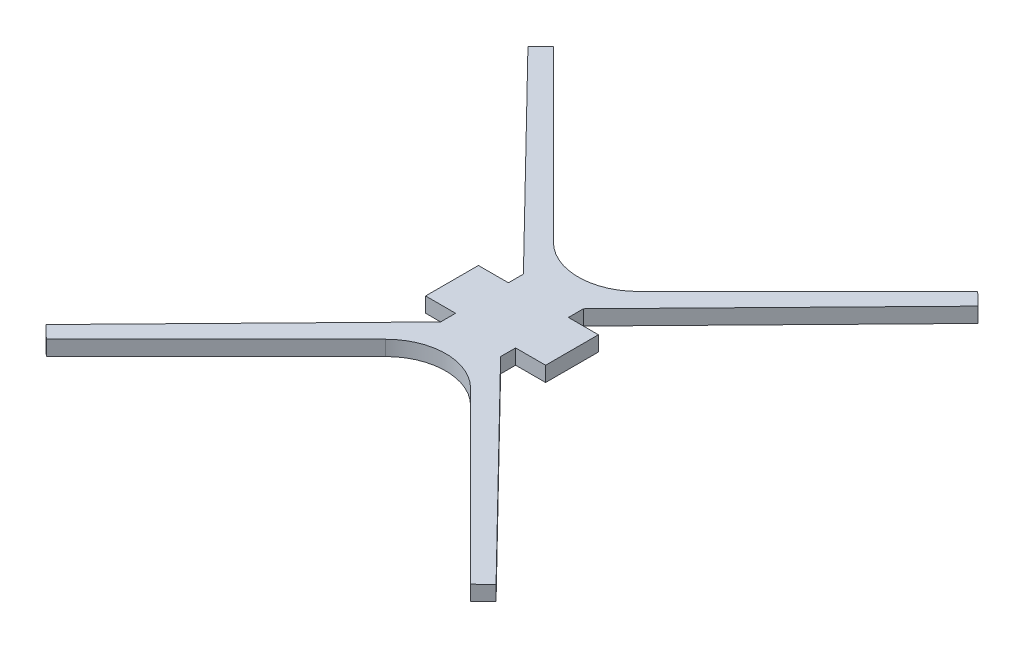
ISO-10303-21;
HEADER;
FILE_DESCRIPTION(('STEP AP214'),'2;1');
FILE_NAME('part.step','',(''),(''),'','','');
FILE_SCHEMA(('AUTOMOTIVE_DESIGN { 1 0 10303 214 1 1 1 1 }'));
ENDSEC;
DATA;
#1=APPLICATION_CONTEXT('core data for automotive mechanical design processes');
#2=APPLICATION_PROTOCOL_DEFINITION('international standard','automotive_design',2000,#1);
#3=PRODUCT_CONTEXT('',#1,'mechanical');
#4=PRODUCT('Part','Part','',(#3));
#5=PRODUCT_RELATED_PRODUCT_CATEGORY('part','',(#4));
#6=PRODUCT_DEFINITION_FORMATION('','',#4);
#7=PRODUCT_DEFINITION_CONTEXT('part definition',#1,'design');
#8=PRODUCT_DEFINITION('design','',#6,#7);
#9=PRODUCT_DEFINITION_SHAPE('','',#8);
#10=(LENGTH_UNIT() NAMED_UNIT(*) SI_UNIT(.MILLI.,.METRE.));
#11=(NAMED_UNIT(*) PLANE_ANGLE_UNIT() SI_UNIT($,.RADIAN.));
#12=(NAMED_UNIT(*) SI_UNIT($,.STERADIAN.) SOLID_ANGLE_UNIT());
#13=UNCERTAINTY_MEASURE_WITH_UNIT(LENGTH_MEASURE(1.E-05),#10,'distance_accuracy_value','');
#14=(GEOMETRIC_REPRESENTATION_CONTEXT(3) GLOBAL_UNCERTAINTY_ASSIGNED_CONTEXT((#13)) GLOBAL_UNIT_ASSIGNED_CONTEXT((#10,
#11,#12)) REPRESENTATION_CONTEXT('',''));
#15=CARTESIAN_POINT('',(0.,0.,0.));
#16=DIRECTION('',(0.,0.,1.));
#17=DIRECTION('',(1.,0.,0.));
#18=AXIS2_PLACEMENT_3D('',#15,#16,#17);
#19=CARTESIAN_POINT('',(19.05,3.175,0.));
#20=DIRECTION('',(-1.,0.,0.));
#21=DIRECTION('',(0.,0.,1.));
#22=AXIS2_PLACEMENT_3D('',#19,#20,#21);
#23=PLANE('',#22);
#24=DIRECTION('',(0.,0.,-1.));
#25=VECTOR('',#24,1.);
#26=CARTESIAN_POINT('',(19.05,0.,0.));
#27=LINE('',#26,#25);
#28=CARTESIAN_POINT('',(19.05,0.,-11.176));
#29=VERTEX_POINT('',#28);
#30=CARTESIAN_POINT('',(19.05,0.,-14.351));
#31=VERTEX_POINT('',#30);
#32=EDGE_CURVE('E242',#29,#31,#27,.T.);
#33=ORIENTED_EDGE('',*,*,#32,.T.);
#34=DIRECTION('',(0.,-1.,0.));
#35=VECTOR('',#34,1.);
#36=CARTESIAN_POINT('',(19.05,3.175,-14.351));
#37=LINE('',#36,#35);
#38=CARTESIAN_POINT('',(19.05,3.175,-14.351));
#39=VERTEX_POINT('',#38);
#40=EDGE_CURVE('E11',#39,#31,#37,.T.);
#41=ORIENTED_EDGE('',*,*,#40,.F.);
#42=DIRECTION('',(0.,0.,-1.));
#43=VECTOR('',#42,1.);
#44=CARTESIAN_POINT('',(19.05,3.175,0.));
#45=LINE('',#44,#43);
#46=CARTESIAN_POINT('',(19.05,3.175,-11.176));
#47=VERTEX_POINT('',#46);
#48=EDGE_CURVE('E473',#47,#39,#45,.T.);
#49=ORIENTED_EDGE('',*,*,#48,.F.);
#50=DIRECTION('',(0.,-1.,0.));
#51=VECTOR('',#50,1.);
#52=CARTESIAN_POINT('',(19.05,3.175,-11.176));
#53=LINE('',#52,#51);
#54=EDGE_CURVE('E58',#47,#29,#53,.T.);
#55=ORIENTED_EDGE('',*,*,#54,.T.);
#56=EDGE_LOOP('',(#33,#41,#49,#55));
#57=FACE_BOUND('',#56,.T.);
#58=ADVANCED_FACE('F41',(#57),#23,.F.);
#59=CARTESIAN_POINT('',(2.57085790076947,3.175,2.51229298466424));
#60=DIRECTION('',(-0.715206160103839,0.,-0.69891354869506));
#61=DIRECTION('',(-0.69891354869506,0.,0.715206160103839));
#62=AXIS2_PLACEMENT_3D('',#59,#60,#61);
#63=PLANE('',#62);
#64=DIRECTION('',(0.69891354869506,0.,-0.715206160103839));
#65=VECTOR('',#64,1.);
#66=CARTESIAN_POINT('',(2.57085790076947,0.,2.51229298466424));
#67=LINE('',#66,#65);
#68=CARTESIAN_POINT('',(60.3262160753413,0.,-56.5894199848176));
#69=VERTEX_POINT('',#68);
#70=EDGE_CURVE('E245',#31,#69,#67,.T.);
#71=ORIENTED_EDGE('',*,*,#70,.T.);
#72=DIRECTION('',(0.,-1.,0.));
#73=VECTOR('',#72,1.);
#74=CARTESIAN_POINT('',(60.3262160753413,3.175,-56.5894199848176));
#75=LINE('',#74,#73);
#76=CARTESIAN_POINT('',(60.3262160753413,3.175,-56.5894199848176));
#77=VERTEX_POINT('',#76);
#78=EDGE_CURVE('E50',#77,#69,#75,.T.);
#79=ORIENTED_EDGE('',*,*,#78,.F.);
#80=DIRECTION('',(0.69891354869506,0.,-0.715206160103839));
#81=VECTOR('',#80,1.);
#82=CARTESIAN_POINT('',(2.57085790076947,3.175,2.51229298466424));
#83=LINE('',#82,#81);
#84=EDGE_CURVE('E145',#39,#77,#83,.T.);
#85=ORIENTED_EDGE('',*,*,#84,.F.);
#86=ORIENTED_EDGE('',*,*,#40,.T.);
#87=EDGE_LOOP('',(#71,#79,#85,#86));
#88=FACE_BOUND('',#87,.T.);
#89=ADVANCED_FACE('F477',(#88),#63,.F.);
#90=CARTESIAN_POINT('',(57.7553581745719,3.175,-59.1017129694818));
#91=DIRECTION('',(-0.698913548695061,0.,0.715206160103838));
#92=DIRECTION('',(0.715206160103838,0.,0.698913548695061));
#93=AXIS2_PLACEMENT_3D('',#90,#91,#92);
#94=PLANE('',#93);
#95=DIRECTION('',(-0.715206160103838,0.,-0.698913548695061));
#96=VECTOR('',#95,1.);
#97=CARTESIAN_POINT('',(57.7553581745719,0.,-59.1017129694818));
#98=LINE('',#97,#96);
#99=CARTESIAN_POINT('',(57.6012806053457,0.,-59.2522806053458));
#100=VERTEX_POINT('',#99);
#101=EDGE_CURVE('E248',#69,#100,#98,.T.);
#102=ORIENTED_EDGE('',*,*,#101,.T.);
#103=DIRECTION('',(0.,-1.,0.));
#104=VECTOR('',#103,1.);
#105=CARTESIAN_POINT('',(57.6012806053457,3.175,-59.2522806053458));
#106=LINE('',#105,#104);
#107=CARTESIAN_POINT('',(57.6012806053457,3.175,-59.2522806053458));
#108=VERTEX_POINT('',#107);
#109=EDGE_CURVE('E385',#108,#100,#106,.T.);
#110=ORIENTED_EDGE('',*,*,#109,.F.);
#111=DIRECTION('',(-0.715206160103838,0.,-0.698913548695061));
#112=VECTOR('',#111,1.);
#113=CARTESIAN_POINT('',(57.7553581745719,3.175,-59.1017129694818));
#114=LINE('',#113,#112);
#115=EDGE_CURVE('E394',#77,#108,#114,.T.);
#116=ORIENTED_EDGE('',*,*,#115,.F.);
#117=ORIENTED_EDGE('',*,*,#78,.T.);
#118=EDGE_LOOP('',(#102,#110,#116,#117));
#119=FACE_BOUND('',#118,.T.);
#120=ADVANCED_FACE('F392',(#119),#94,.F.);
#121=CARTESIAN_POINT('',(-0.825499999999981,3.175,-0.825499999999979));
#122=DIRECTION('',(-0.707106781186549,0.,-0.707106781186546));
#123=DIRECTION('',(-0.707106781186546,0.,0.707106781186549));
#124=AXIS2_PLACEMENT_3D('',#121,#122,#123);
#125=PLANE('',#124);
#126=DIRECTION('',(0.707106781186546,0.,-0.707106781186549));
#127=VECTOR('',#126,1.);
#128=CARTESIAN_POINT('',(-0.825499999999981,0.,-0.825499999999979));
#129=LINE('',#128,#127);
#130=CARTESIAN_POINT('',(21.6802561210692,0.,-23.3312561210693));
#131=VERTEX_POINT('',#130);
#132=EDGE_CURVE('E252',#131,#100,#129,.T.);
#133=ORIENTED_EDGE('',*,*,#132,.F.);
#134=DIRECTION('',(0.,-1.,0.));
#135=VECTOR('',#134,1.);
#136=CARTESIAN_POINT('',(21.6802561210692,3.175,-23.3312561210693));
#137=LINE('',#136,#135);
#138=CARTESIAN_POINT('',(21.6802561210692,3.175,-23.3312561210693));
#139=VERTEX_POINT('',#138);
#140=EDGE_CURVE('E382',#139,#131,#137,.T.);
#141=ORIENTED_EDGE('',*,*,#140,.F.);
#142=DIRECTION('',(0.707106781186546,0.,-0.707106781186549));
#143=VECTOR('',#142,1.);
#144=CARTESIAN_POINT('',(-0.825499999999981,3.175,-0.825499999999979));
#145=LINE('',#144,#143);
#146=EDGE_CURVE('E405',#139,#108,#145,.T.);
#147=ORIENTED_EDGE('',*,*,#146,.T.);
#148=ORIENTED_EDGE('',*,*,#109,.T.);
#149=EDGE_LOOP('',(#133,#141,#147,#148));
#150=FACE_BOUND('',#149,.T.);
#151=ADVANCED_FACE('F401',(#150),#125,.T.);
#152=CARTESIAN_POINT('',(12.7,3.175,-32.3115122421383));
#153=DIRECTION('',(0.,-1.,0.));
#154=DIRECTION('',(0.,0.,-1.));
#155=AXIS2_PLACEMENT_3D('',#152,#153,#154);
#156=CYLINDRICAL_SURFACE('',#155,12.7);
#157=CARTESIAN_POINT('',(12.7,0.,-32.3115122421383));
#158=DIRECTION('',(0.,1.,0.));
#159=DIRECTION('',(0.,0.,1.));
#160=AXIS2_PLACEMENT_3D('',#157,#158,#159);
#161=CIRCLE('',#160,12.7);
#162=CARTESIAN_POINT('',(3.71974387893077,0.,-23.3312561210693));
#163=VERTEX_POINT('',#162);
#164=EDGE_CURVE('E256',#131,#163,#161,.F.);
#165=ORIENTED_EDGE('',*,*,#164,.T.);
#166=DIRECTION('',(0.,-1.,0.));
#167=VECTOR('',#166,1.);
#168=CARTESIAN_POINT('',(3.71974387893077,3.175,-23.3312561210693));
#169=LINE('',#168,#167);
#170=CARTESIAN_POINT('',(3.71974387893077,3.175,-23.3312561210693));
#171=VERTEX_POINT('',#170);
#172=EDGE_CURVE('E378',#171,#163,#169,.T.);
#173=ORIENTED_EDGE('',*,*,#172,.F.);
#174=CARTESIAN_POINT('',(12.7,3.175,-32.3115122421383));
#175=DIRECTION('',(0.,1.,0.));
#176=DIRECTION('',(0.,0.,1.));
#177=AXIS2_PLACEMENT_3D('',#174,#175,#176);
#178=CIRCLE('',#177,12.7);
#179=EDGE_CURVE('E407',#139,#171,#178,.F.);
#180=ORIENTED_EDGE('',*,*,#179,.F.);
#181=ORIENTED_EDGE('',*,*,#140,.T.);
#182=EDGE_LOOP('',(#165,#173,#180,#181));
#183=FACE_BOUND('',#182,.T.);
#184=ADVANCED_FACE('F487',(#183),#156,.F.);
#185=CARTESIAN_POINT('',(13.5255,3.175,-13.5255));
#186=DIRECTION('',(-0.707106781186549,0.,0.707106781186546));
#187=DIRECTION('',(0.707106781186546,0.,0.707106781186549));
#188=AXIS2_PLACEMENT_3D('',#185,#186,#187);
#189=PLANE('',#188);
#190=DIRECTION('',(-0.707106781186546,0.,-0.707106781186549));
#191=VECTOR('',#190,1.);
#192=CARTESIAN_POINT('',(13.5255,0.,-13.5255));
#193=LINE('',#192,#191);
#194=CARTESIAN_POINT('',(-32.2012806053457,0.,-59.2522806053458));
#195=VERTEX_POINT('',#194);
#196=EDGE_CURVE('E259',#163,#195,#193,.T.);
#197=ORIENTED_EDGE('',*,*,#196,.T.);
#198=DIRECTION('',(0.,-1.,0.));
#199=VECTOR('',#198,1.);
#200=CARTESIAN_POINT('',(-32.2012806053457,3.175,-59.2522806053458));
#201=LINE('',#200,#199);
#202=CARTESIAN_POINT('',(-32.2012806053457,3.175,-59.2522806053458));
#203=VERTEX_POINT('',#202);
#204=EDGE_CURVE('E375',#203,#195,#201,.T.);
#205=ORIENTED_EDGE('',*,*,#204,.F.);
#206=DIRECTION('',(-0.707106781186546,0.,-0.707106781186549));
#207=VECTOR('',#206,1.);
#208=CARTESIAN_POINT('',(13.5255,3.175,-13.5255));
#209=LINE('',#208,#207);
#210=EDGE_CURVE('E411',#171,#203,#209,.T.);
#211=ORIENTED_EDGE('',*,*,#210,.F.);
#212=ORIENTED_EDGE('',*,*,#172,.T.);
#213=EDGE_LOOP('',(#197,#205,#211,#212));
#214=FACE_BOUND('',#213,.T.);
#215=ADVANCED_FACE('F490',(#214),#189,.F.);
#216=CARTESIAN_POINT('',(-45.347962401414,3.175,-46.4050841741507));
#217=DIRECTION('',(-0.69891354869506,0.,-0.715206160103839));
#218=DIRECTION('',(-0.715206160103839,0.,0.69891354869506));
#219=AXIS2_PLACEMENT_3D('',#216,#217,#218);
#220=PLANE('',#219);
#221=DIRECTION('',(0.715206160103839,0.,-0.69891354869506));
#222=VECTOR('',#221,1.);
#223=CARTESIAN_POINT('',(-45.347962401414,0.,-46.4050841741507));
#224=LINE('',#223,#222);
#225=CARTESIAN_POINT('',(-34.9262160753413,0.,-56.5894199848177));
#226=VERTEX_POINT('',#225);
#227=EDGE_CURVE('E263',#226,#195,#224,.T.);
#228=ORIENTED_EDGE('',*,*,#227,.F.);
#229=DIRECTION('',(0.,-1.,0.));
#230=VECTOR('',#229,1.);
#231=CARTESIAN_POINT('',(-34.9262160753413,3.175,-56.5894199848177));
#232=LINE('',#231,#230);
#233=CARTESIAN_POINT('',(-34.9262160753413,3.175,-56.5894199848177));
#234=VERTEX_POINT('',#233);
#235=EDGE_CURVE('E372',#234,#226,#232,.T.);
#236=ORIENTED_EDGE('',*,*,#235,.F.);
#237=DIRECTION('',(0.715206160103839,0.,-0.69891354869506));
#238=VECTOR('',#237,1.);
#239=CARTESIAN_POINT('',(-45.347962401414,3.175,-46.4050841741507));
#240=LINE('',#239,#238);
#241=EDGE_CURVE('E418',#234,#203,#240,.T.);
#242=ORIENTED_EDGE('',*,*,#241,.T.);
#243=ORIENTED_EDGE('',*,*,#204,.T.);
#244=EDGE_LOOP('',(#228,#236,#242,#243));
#245=FACE_BOUND('',#244,.T.);
#246=ADVANCED_FACE('F494',(#245),#220,.T.);
#247=CARTESIAN_POINT('',(10.4217463260727,3.175,-10.184335810667));
#248=DIRECTION('',(-0.715206160103839,0.,0.69891354869506));
#249=DIRECTION('',(0.69891354869506,0.,0.715206160103839));
#250=AXIS2_PLACEMENT_3D('',#247,#248,#249);
#251=PLANE('',#250);
#252=DIRECTION('',(-0.69891354869506,0.,-0.715206160103839));
#253=VECTOR('',#252,1.);
#254=CARTESIAN_POINT('',(10.4217463260727,0.,-10.184335810667));
#255=LINE('',#254,#253);
#256=CARTESIAN_POINT('',(6.35,0.,-14.351));
#257=VERTEX_POINT('',#256);
#258=EDGE_CURVE('E267',#257,#226,#255,.T.);
#259=ORIENTED_EDGE('',*,*,#258,.F.);
#260=DIRECTION('',(0.,-1.,0.));
#261=VECTOR('',#260,1.);
#262=CARTESIAN_POINT('',(6.35,3.175,-14.351));
#263=LINE('',#262,#261);
#264=CARTESIAN_POINT('',(6.35,3.175,-14.351));
#265=VERTEX_POINT('',#264);
#266=EDGE_CURVE('E369',#265,#257,#263,.T.);
#267=ORIENTED_EDGE('',*,*,#266,.F.);
#268=DIRECTION('',(-0.69891354869506,0.,-0.715206160103839));
#269=VECTOR('',#268,1.);
#270=CARTESIAN_POINT('',(10.4217463260727,3.175,-10.184335810667));
#271=LINE('',#270,#269);
#272=EDGE_CURVE('E422',#265,#234,#271,.T.);
#273=ORIENTED_EDGE('',*,*,#272,.T.);
#274=ORIENTED_EDGE('',*,*,#235,.T.);
#275=EDGE_LOOP('',(#259,#267,#273,#274));
#276=FACE_BOUND('',#275,.T.);
#277=ADVANCED_FACE('F498',(#276),#251,.T.);
#278=CARTESIAN_POINT('',(6.35,3.175,0.));
#279=DIRECTION('',(-1.,0.,0.));
#280=DIRECTION('',(0.,0.,1.));
#281=AXIS2_PLACEMENT_3D('',#278,#279,#280);
#282=PLANE('',#281);
#283=DIRECTION('',(0.,0.,-1.));
#284=VECTOR('',#283,1.);
#285=CARTESIAN_POINT('',(6.35,0.,0.));
#286=LINE('',#285,#284);
#287=CARTESIAN_POINT('',(6.35,0.,-11.176));
#288=VERTEX_POINT('',#287);
#289=EDGE_CURVE('E271',#288,#257,#286,.T.);
#290=ORIENTED_EDGE('',*,*,#289,.F.);
#291=DIRECTION('',(0.,-1.,0.));
#292=VECTOR('',#291,1.);
#293=CARTESIAN_POINT('',(6.35,3.175,-11.176));
#294=LINE('',#293,#292);
#295=CARTESIAN_POINT('',(6.35,3.175,-11.176));
#296=VERTEX_POINT('',#295);
#297=EDGE_CURVE('E366',#296,#288,#294,.T.);
#298=ORIENTED_EDGE('',*,*,#297,.F.);
#299=DIRECTION('',(0.,0.,-1.));
#300=VECTOR('',#299,1.);
#301=CARTESIAN_POINT('',(6.35,3.175,0.));
#302=LINE('',#301,#300);
#303=EDGE_CURVE('E426',#296,#265,#302,.T.);
#304=ORIENTED_EDGE('',*,*,#303,.T.);
#305=ORIENTED_EDGE('',*,*,#266,.T.);
#306=EDGE_LOOP('',(#290,#298,#304,#305));
#307=FACE_BOUND('',#306,.T.);
#308=ADVANCED_FACE('F502',(#307),#282,.T.);
#309=CARTESIAN_POINT('',(0.,3.175,-11.176));
#310=DIRECTION('',(0.,0.,-1.));
#311=DIRECTION('',(-1.,0.,0.));
#312=AXIS2_PLACEMENT_3D('',#309,#310,#311);
#313=PLANE('',#312);
#314=DIRECTION('',(1.,0.,0.));
#315=VECTOR('',#314,1.);
#316=CARTESIAN_POINT('',(0.,0.,-11.176));
#317=LINE('',#316,#315);
#318=CARTESIAN_POINT('',(0.,0.,-11.176));
#319=VERTEX_POINT('',#318);
#320=EDGE_CURVE('E275',#319,#288,#317,.T.);
#321=ORIENTED_EDGE('',*,*,#320,.F.);
#322=DIRECTION('',(0.,-1.,0.));
#323=VECTOR('',#322,1.);
#324=CARTESIAN_POINT('',(0.,3.175,-11.176));
#325=LINE('',#324,#323);
#326=CARTESIAN_POINT('',(0.,3.175,-11.176));
#327=VERTEX_POINT('',#326);
#328=EDGE_CURVE('E363',#327,#319,#325,.T.);
#329=ORIENTED_EDGE('',*,*,#328,.F.);
#330=DIRECTION('',(1.,0.,0.));
#331=VECTOR('',#330,1.);
#332=CARTESIAN_POINT('',(0.,3.175,-11.176));
#333=LINE('',#332,#331);
#334=EDGE_CURVE('E238',#327,#296,#333,.T.);
#335=ORIENTED_EDGE('',*,*,#334,.T.);
#336=ORIENTED_EDGE('',*,*,#297,.T.);
#337=EDGE_LOOP('',(#321,#329,#335,#336));
#338=FACE_BOUND('',#337,.T.);
#339=ADVANCED_FACE('F506',(#338),#313,.T.);
#340=CARTESIAN_POINT('',(0.,3.175,0.));
#341=DIRECTION('',(-1.,0.,0.));
#342=DIRECTION('',(0.,0.,1.));
#343=AXIS2_PLACEMENT_3D('',#340,#341,#342);
#344=PLANE('',#343);
#345=DIRECTION('',(0.,0.,-1.));
#346=VECTOR('',#345,1.);
#347=CARTESIAN_POINT('',(0.,0.,0.));
#348=LINE('',#347,#346);
#349=CARTESIAN_POINT('',(0.,0.,0.));
#350=VERTEX_POINT('',#349);
#351=EDGE_CURVE('E279',#350,#319,#348,.T.);
#352=ORIENTED_EDGE('',*,*,#351,.F.);
#353=DIRECTION('',(0.,-1.,0.));
#354=VECTOR('',#353,1.);
#355=CARTESIAN_POINT('',(0.,3.175,0.));
#356=LINE('',#355,#354);
#357=CARTESIAN_POINT('',(0.,3.175,0.));
#358=VERTEX_POINT('',#357);
#359=EDGE_CURVE('E360',#358,#350,#356,.T.);
#360=ORIENTED_EDGE('',*,*,#359,.F.);
#361=DIRECTION('',(0.,0.,-1.));
#362=VECTOR('',#361,1.);
#363=CARTESIAN_POINT('',(0.,3.175,0.));
#364=LINE('',#363,#362);
#365=EDGE_CURVE('E432',#358,#327,#364,.T.);
#366=ORIENTED_EDGE('',*,*,#365,.T.);
#367=ORIENTED_EDGE('',*,*,#328,.T.);
#368=EDGE_LOOP('',(#352,#360,#366,#367));
#369=FACE_BOUND('',#368,.T.);
#370=ADVANCED_FACE('F508',(#369),#344,.T.);
#371=CARTESIAN_POINT('',(0.,3.175,0.));
#372=DIRECTION('',(0.,0.,-1.));
#373=DIRECTION('',(-1.,0.,0.));
#374=AXIS2_PLACEMENT_3D('',#371,#372,#373);
#375=PLANE('',#374);
#376=DIRECTION('',(1.,0.,0.));
#377=VECTOR('',#376,1.);
#378=CARTESIAN_POINT('',(0.,0.,0.));
#379=LINE('',#378,#377);
#380=CARTESIAN_POINT('',(6.35,0.,0.));
#381=VERTEX_POINT('',#380);
#382=EDGE_CURVE('E284',#350,#381,#379,.T.);
#383=ORIENTED_EDGE('',*,*,#382,.T.);
#384=DIRECTION('',(0.,-1.,0.));
#385=VECTOR('',#384,1.);
#386=CARTESIAN_POINT('',(6.35,3.175,0.));
#387=LINE('',#386,#385);
#388=CARTESIAN_POINT('',(6.35,3.175,0.));
#389=VERTEX_POINT('',#388);
#390=EDGE_CURVE('E356',#389,#381,#387,.T.);
#391=ORIENTED_EDGE('',*,*,#390,.F.);
#392=DIRECTION('',(1.,0.,0.));
#393=VECTOR('',#392,1.);
#394=CARTESIAN_POINT('',(0.,3.175,0.));
#395=LINE('',#394,#393);
#396=EDGE_CURVE('E221',#358,#389,#395,.T.);
#397=ORIENTED_EDGE('',*,*,#396,.F.);
#398=ORIENTED_EDGE('',*,*,#359,.T.);
#399=EDGE_LOOP('',(#383,#391,#397,#398));
#400=FACE_BOUND('',#399,.T.);
#401=ADVANCED_FACE('F511',(#400),#375,.F.);
#402=CARTESIAN_POINT('',(6.35,3.175,0.));
#403=DIRECTION('',(1.,0.,0.));
#404=DIRECTION('',(0.,0.,-1.));
#405=AXIS2_PLACEMENT_3D('',#402,#403,#404);
#406=PLANE('',#405);
#407=DIRECTION('',(0.,0.,1.));
#408=VECTOR('',#407,1.);
#409=CARTESIAN_POINT('',(6.35,0.,0.));
#410=LINE('',#409,#408);
#411=CARTESIAN_POINT('',(6.35,0.,3.175));
#412=VERTEX_POINT('',#411);
#413=EDGE_CURVE('E287',#381,#412,#410,.T.);
#414=ORIENTED_EDGE('',*,*,#413,.T.);
#415=DIRECTION('',(0.,-1.,0.));
#416=VECTOR('',#415,1.);
#417=CARTESIAN_POINT('',(6.35,3.175,3.175));
#418=LINE('',#417,#416);
#419=CARTESIAN_POINT('',(6.35,3.175,3.175));
#420=VERTEX_POINT('',#419);
#421=EDGE_CURVE('E352',#420,#412,#418,.T.);
#422=ORIENTED_EDGE('',*,*,#421,.F.);
#423=DIRECTION('',(0.,0.,1.));
#424=VECTOR('',#423,1.);
#425=CARTESIAN_POINT('',(6.35,3.175,0.));
#426=LINE('',#425,#424);
#427=EDGE_CURVE('E437',#389,#420,#426,.T.);
#428=ORIENTED_EDGE('',*,*,#427,.F.);
#429=ORIENTED_EDGE('',*,*,#390,.T.);
#430=EDGE_LOOP('',(#414,#422,#428,#429));
#431=FACE_BOUND('',#430,.T.);
#432=ADVANCED_FACE('F513',(#431),#406,.F.);
#433=CARTESIAN_POINT('',(4.83522965612694,3.175,4.72508167047754));
#434=DIRECTION('',(0.715206160103839,0.,0.69891354869506));
#435=DIRECTION('',(0.69891354869506,0.,-0.715206160103839));
#436=AXIS2_PLACEMENT_3D('',#433,#434,#435);
#437=PLANE('',#436);
#438=DIRECTION('',(-0.69891354869506,0.,0.715206160103839));
#439=VECTOR('',#438,1.);
#440=CARTESIAN_POINT('',(4.83522965612694,0.,4.72508167047754));
#441=LINE('',#440,#439);
#442=CARTESIAN_POINT('',(-34.9262160753413,0.,45.4134199848176));
#443=VERTEX_POINT('',#442);
#444=EDGE_CURVE('E290',#412,#443,#441,.T.);
#445=ORIENTED_EDGE('',*,*,#444,.T.);
#446=DIRECTION('',(0.,-1.,0.));
#447=VECTOR('',#446,1.);
#448=CARTESIAN_POINT('',(-34.9262160753413,3.175,45.4134199848176));
#449=LINE('',#448,#447);
#450=CARTESIAN_POINT('',(-34.9262160753413,3.175,45.4134199848176));
#451=VERTEX_POINT('',#450);
#452=EDGE_CURVE('E348',#451,#443,#449,.T.);
#453=ORIENTED_EDGE('',*,*,#452,.F.);
#454=DIRECTION('',(-0.69891354869506,0.,0.715206160103839));
#455=VECTOR('',#454,1.);
#456=CARTESIAN_POINT('',(4.83522965612694,3.175,4.72508167047754));
#457=LINE('',#456,#455);
#458=EDGE_CURVE('E440',#420,#451,#457,.T.);
#459=ORIENTED_EDGE('',*,*,#458,.F.);
#460=ORIENTED_EDGE('',*,*,#421,.T.);
#461=EDGE_LOOP('',(#445,#453,#459,#460));
#462=FACE_BOUND('',#461,.T.);
#463=ADVANCED_FACE('F516',(#462),#437,.F.);
#464=CARTESIAN_POINT('',(-39.7614457314684,3.175,40.6883383143399));
#465=DIRECTION('',(0.698913548695062,0.,-0.715206160103837));
#466=DIRECTION('',(-0.715206160103837,0.,-0.698913548695062));
#467=AXIS2_PLACEMENT_3D('',#464,#465,#466);
#468=PLANE('',#467);
#469=DIRECTION('',(0.715206160103837,0.,0.698913548695062));
#470=VECTOR('',#469,1.);
#471=CARTESIAN_POINT('',(-39.7614457314684,0.,40.6883383143399));
#472=LINE('',#471,#470);
#473=CARTESIAN_POINT('',(-32.2012806053457,0.,48.0762806053458));
#474=VERTEX_POINT('',#473);
#475=EDGE_CURVE('E293',#443,#474,#472,.T.);
#476=ORIENTED_EDGE('',*,*,#475,.T.);
#477=DIRECTION('',(0.,-1.,0.));
#478=VECTOR('',#477,1.);
#479=CARTESIAN_POINT('',(-32.2012806053457,3.175,48.0762806053458));
#480=LINE('',#479,#478);
#481=CARTESIAN_POINT('',(-32.2012806053457,3.175,48.0762806053458));
#482=VERTEX_POINT('',#481);
#483=EDGE_CURVE('E345',#482,#474,#480,.T.);
#484=ORIENTED_EDGE('',*,*,#483,.F.);
#485=DIRECTION('',(0.715206160103837,0.,0.698913548695062));
#486=VECTOR('',#485,1.);
#487=CARTESIAN_POINT('',(-39.7614457314684,3.175,40.6883383143399));
#488=LINE('',#487,#486);
#489=EDGE_CURVE('E443',#451,#482,#488,.T.);
#490=ORIENTED_EDGE('',*,*,#489,.F.);
#491=ORIENTED_EDGE('',*,*,#452,.T.);
#492=EDGE_LOOP('',(#476,#484,#490,#491));
#493=FACE_BOUND('',#492,.T.);
#494=ADVANCED_FACE('F520',(#493),#468,.F.);
#495=CARTESIAN_POINT('',(7.93750000000002,3.175,7.9375));
#496=DIRECTION('',(0.707106781186548,0.,0.707106781186547));
#497=DIRECTION('',(0.707106781186547,0.,-0.707106781186548));
#498=AXIS2_PLACEMENT_3D('',#495,#496,#497);
#499=PLANE('',#498);
#500=DIRECTION('',(-0.707106781186547,0.,0.707106781186549));
#501=VECTOR('',#500,1.);
#502=CARTESIAN_POINT('',(7.93750000000002,0.,7.9375));
#503=LINE('',#502,#501);
#504=CARTESIAN_POINT('',(3.71974387893076,0.,12.1552561210693));
#505=VERTEX_POINT('',#504);
#506=EDGE_CURVE('E297',#505,#474,#503,.T.);
#507=ORIENTED_EDGE('',*,*,#506,.F.);
#508=DIRECTION('',(0.,-1.,0.));
#509=VECTOR('',#508,1.);
#510=CARTESIAN_POINT('',(3.71974387893076,3.175,12.1552561210693));
#511=LINE('',#510,#509);
#512=CARTESIAN_POINT('',(3.71974387893076,3.175,12.1552561210693));
#513=VERTEX_POINT('',#512);
#514=EDGE_CURVE('E342',#513,#505,#511,.T.);
#515=ORIENTED_EDGE('',*,*,#514,.F.);
#516=DIRECTION('',(-0.707106781186547,0.,0.707106781186549));
#517=VECTOR('',#516,1.);
#518=CARTESIAN_POINT('',(7.93750000000002,3.175,7.9375));
#519=LINE('',#518,#517);
#520=EDGE_CURVE('E446',#513,#482,#519,.T.);
#521=ORIENTED_EDGE('',*,*,#520,.T.);
#522=ORIENTED_EDGE('',*,*,#483,.T.);
#523=EDGE_LOOP('',(#507,#515,#521,#522));
#524=FACE_BOUND('',#523,.T.);
#525=ADVANCED_FACE('F524',(#524),#499,.T.);
#526=CARTESIAN_POINT('',(12.7,3.175,21.1355122421383));
#527=DIRECTION('',(0.,-1.,0.));
#528=DIRECTION('',(0.,0.,-1.));
#529=AXIS2_PLACEMENT_3D('',#526,#527,#528);
#530=CYLINDRICAL_SURFACE('',#529,12.7);
#531=CARTESIAN_POINT('',(12.7,0.,21.1355122421383));
#532=DIRECTION('',(0.,1.,0.));
#533=DIRECTION('',(0.,0.,1.));
#534=AXIS2_PLACEMENT_3D('',#531,#532,#533);
#535=CIRCLE('',#534,12.7);
#536=CARTESIAN_POINT('',(21.6802561210692,0.,12.1552561210693));
#537=VERTEX_POINT('',#536);
#538=EDGE_CURVE('E301',#537,#505,#535,.T.);
#539=ORIENTED_EDGE('',*,*,#538,.F.);
#540=DIRECTION('',(0.,-1.,0.));
#541=VECTOR('',#540,1.);
#542=CARTESIAN_POINT('',(21.6802561210692,3.175,12.1552561210693));
#543=LINE('',#542,#541);
#544=CARTESIAN_POINT('',(21.6802561210692,3.175,12.1552561210693));
#545=VERTEX_POINT('',#544);
#546=EDGE_CURVE('E339',#545,#537,#543,.T.);
#547=ORIENTED_EDGE('',*,*,#546,.F.);
#548=CARTESIAN_POINT('',(12.7,3.175,21.1355122421383));
#549=DIRECTION('',(0.,1.,0.));
#550=DIRECTION('',(0.,0.,1.));
#551=AXIS2_PLACEMENT_3D('',#548,#549,#550);
#552=CIRCLE('',#551,12.7);
#553=EDGE_CURVE('E450',#545,#513,#552,.T.);
#554=ORIENTED_EDGE('',*,*,#553,.T.);
#555=ORIENTED_EDGE('',*,*,#514,.T.);
#556=EDGE_LOOP('',(#539,#547,#554,#555));
#557=FACE_BOUND('',#556,.T.);
#558=ADVANCED_FACE('F528',(#557),#530,.F.);
#559=CARTESIAN_POINT('',(4.76250000000002,3.175,-4.7625));
#560=DIRECTION('',(0.707106781186548,0.,-0.707106781186546));
#561=DIRECTION('',(-0.707106781186547,0.,-0.707106781186549));
#562=AXIS2_PLACEMENT_3D('',#559,#560,#561);
#563=PLANE('',#562);
#564=DIRECTION('',(0.707106781186546,0.,0.707106781186549));
#565=VECTOR('',#564,1.);
#566=CARTESIAN_POINT('',(4.76250000000002,0.,-4.7625));
#567=LINE('',#566,#565);
#568=CARTESIAN_POINT('',(57.6012806053457,0.,48.0762806053458));
#569=VERTEX_POINT('',#568);
#570=EDGE_CURVE('E305',#537,#569,#567,.T.);
#571=ORIENTED_EDGE('',*,*,#570,.T.);
#572=DIRECTION('',(0.,-1.,0.));
#573=VECTOR('',#572,1.);
#574=CARTESIAN_POINT('',(57.6012806053457,3.175,48.0762806053458));
#575=LINE('',#574,#573);
#576=CARTESIAN_POINT('',(57.6012806053457,3.175,48.0762806053458));
#577=VERTEX_POINT('',#576);
#578=EDGE_CURVE('E336',#577,#569,#575,.T.);
#579=ORIENTED_EDGE('',*,*,#578,.F.);
#580=DIRECTION('',(0.707106781186546,0.,0.707106781186549));
#581=VECTOR('',#580,1.);
#582=CARTESIAN_POINT('',(4.76250000000002,3.175,-4.7625));
#583=LINE('',#582,#581);
#584=EDGE_CURVE('E454',#545,#577,#583,.T.);
#585=ORIENTED_EDGE('',*,*,#584,.F.);
#586=ORIENTED_EDGE('',*,*,#546,.T.);
#587=EDGE_LOOP('',(#571,#579,#585,#586));
#588=FACE_BOUND('',#587,.T.);
#589=ADVANCED_FACE('F532',(#588),#563,.F.);
#590=CARTESIAN_POINT('',(52.1688415046262,3.175,53.3849671096713));
#591=DIRECTION('',(0.698913548695061,0.,0.715206160103838));
#592=DIRECTION('',(0.715206160103838,0.,-0.698913548695061));
#593=AXIS2_PLACEMENT_3D('',#590,#591,#592);
#594=PLANE('',#593);
#595=DIRECTION('',(-0.715206160103838,0.,0.698913548695061));
#596=VECTOR('',#595,1.);
#597=CARTESIAN_POINT('',(52.1688415046262,0.,53.3849671096713));
#598=LINE('',#597,#596);
#599=CARTESIAN_POINT('',(60.3262160753413,0.,45.4134199848176));
#600=VERTEX_POINT('',#599);
#601=EDGE_CURVE('E309',#600,#569,#598,.T.);
#602=ORIENTED_EDGE('',*,*,#601,.F.);
#603=DIRECTION('',(0.,-1.,0.));
#604=VECTOR('',#603,1.);
#605=CARTESIAN_POINT('',(60.3262160753413,3.175,45.4134199848176));
#606=LINE('',#605,#604);
#607=CARTESIAN_POINT('',(60.3262160753413,3.175,45.4134199848176));
#608=VERTEX_POINT('',#607);
#609=EDGE_CURVE('E333',#608,#600,#606,.T.);
#610=ORIENTED_EDGE('',*,*,#609,.F.);
#611=DIRECTION('',(-0.715206160103838,0.,0.698913548695061));
#612=VECTOR('',#611,1.);
#613=CARTESIAN_POINT('',(52.1688415046262,3.175,53.3849671096713));
#614=LINE('',#613,#612);
#615=EDGE_CURVE('E457',#608,#577,#614,.T.);
#616=ORIENTED_EDGE('',*,*,#615,.T.);
#617=ORIENTED_EDGE('',*,*,#578,.T.);
#618=EDGE_LOOP('',(#602,#610,#616,#617));
#619=FACE_BOUND('',#618,.T.);
#620=ADVANCED_FACE('F536',(#619),#594,.T.);
#621=CARTESIAN_POINT('',(8.15737457071521,3.175,-7.97154712485369));
#622=DIRECTION('',(0.715206160103839,0.,-0.69891354869506));
#623=DIRECTION('',(-0.69891354869506,0.,-0.715206160103839));
#624=AXIS2_PLACEMENT_3D('',#621,#622,#623);
#625=PLANE('',#624);
#626=DIRECTION('',(0.69891354869506,0.,0.715206160103839));
#627=VECTOR('',#626,1.);
#628=CARTESIAN_POINT('',(8.15737457071521,0.,-7.97154712485369));
#629=LINE('',#628,#627);
#630=CARTESIAN_POINT('',(19.05,0.,3.175));
#631=VERTEX_POINT('',#630);
#632=EDGE_CURVE('E313',#631,#600,#629,.T.);
#633=ORIENTED_EDGE('',*,*,#632,.F.);
#634=DIRECTION('',(0.,-1.,0.));
#635=VECTOR('',#634,1.);
#636=CARTESIAN_POINT('',(19.05,3.175,3.175));
#637=LINE('',#636,#635);
#638=CARTESIAN_POINT('',(19.05,3.175,3.175));
#639=VERTEX_POINT('',#638);
#640=EDGE_CURVE('E330',#639,#631,#637,.T.);
#641=ORIENTED_EDGE('',*,*,#640,.F.);
#642=DIRECTION('',(0.69891354869506,0.,0.715206160103839));
#643=VECTOR('',#642,1.);
#644=CARTESIAN_POINT('',(8.15737457071521,3.175,-7.97154712485369));
#645=LINE('',#644,#643);
#646=EDGE_CURVE('E460',#639,#608,#645,.T.);
#647=ORIENTED_EDGE('',*,*,#646,.T.);
#648=ORIENTED_EDGE('',*,*,#609,.T.);
#649=EDGE_LOOP('',(#633,#641,#647,#648));
#650=FACE_BOUND('',#649,.T.);
#651=ADVANCED_FACE('F540',(#650),#625,.T.);
#652=CARTESIAN_POINT('',(19.05,3.175,0.));
#653=DIRECTION('',(1.,0.,0.));
#654=DIRECTION('',(0.,0.,-1.));
#655=AXIS2_PLACEMENT_3D('',#652,#653,#654);
#656=PLANE('',#655);
#657=DIRECTION('',(0.,0.,1.));
#658=VECTOR('',#657,1.);
#659=CARTESIAN_POINT('',(19.05,0.,0.));
#660=LINE('',#659,#658);
#661=CARTESIAN_POINT('',(19.05,0.,0.));
#662=VERTEX_POINT('',#661);
#663=EDGE_CURVE('E317',#662,#631,#660,.T.);
#664=ORIENTED_EDGE('',*,*,#663,.F.);
#665=DIRECTION('',(0.,-1.,0.));
#666=VECTOR('',#665,1.);
#667=CARTESIAN_POINT('',(19.05,3.175,0.));
#668=LINE('',#667,#666);
#669=CARTESIAN_POINT('',(19.05,3.175,0.));
#670=VERTEX_POINT('',#669);
#671=EDGE_CURVE('E230',#670,#662,#668,.T.);
#672=ORIENTED_EDGE('',*,*,#671,.F.);
#673=DIRECTION('',(0.,0.,1.));
#674=VECTOR('',#673,1.);
#675=CARTESIAN_POINT('',(19.05,3.175,0.));
#676=LINE('',#675,#674);
#677=EDGE_CURVE('E217',#670,#639,#676,.T.);
#678=ORIENTED_EDGE('',*,*,#677,.T.);
#679=ORIENTED_EDGE('',*,*,#640,.T.);
#680=EDGE_LOOP('',(#664,#672,#678,#679));
#681=FACE_BOUND('',#680,.T.);
#682=ADVANCED_FACE('F467',(#681),#656,.T.);
#683=CARTESIAN_POINT('',(25.4,0.,0.));
#684=VERTEX_POINT('',#683);
#685=EDGE_CURVE('E226',#662,#684,#379,.T.);
#686=ORIENTED_EDGE('',*,*,#685,.T.);
#687=DIRECTION('',(0.,-1.,0.));
#688=VECTOR('',#687,1.);
#689=CARTESIAN_POINT('',(25.4,3.175,0.));
#690=LINE('',#689,#688);
#691=CARTESIAN_POINT('',(25.4,3.175,0.));
#692=VERTEX_POINT('',#691);
#693=EDGE_CURVE('E223',#692,#684,#690,.T.);
#694=ORIENTED_EDGE('',*,*,#693,.F.);
#695=EDGE_CURVE('E209',#670,#692,#395,.T.);
#696=ORIENTED_EDGE('',*,*,#695,.F.);
#697=ORIENTED_EDGE('',*,*,#671,.T.);
#698=EDGE_LOOP('',(#686,#694,#696,#697));
#699=FACE_BOUND('',#698,.T.);
#700=ADVANCED_FACE('F224',(#699),#375,.F.);
#701=CARTESIAN_POINT('',(25.4,3.175,0.));
#702=DIRECTION('',(-1.,0.,0.));
#703=DIRECTION('',(0.,0.,1.));
#704=AXIS2_PLACEMENT_3D('',#701,#702,#703);
#705=PLANE('',#704);
#706=DIRECTION('',(0.,0.,-1.));
#707=VECTOR('',#706,1.);
#708=CARTESIAN_POINT('',(25.4,0.,0.));
#709=LINE('',#708,#707);
#710=CARTESIAN_POINT('',(25.4,0.,-11.176));
#711=VERTEX_POINT('',#710);
#712=EDGE_CURVE('E321',#684,#711,#709,.T.);
#713=ORIENTED_EDGE('',*,*,#712,.T.);
#714=DIRECTION('',(0.,-1.,0.));
#715=VECTOR('',#714,1.);
#716=CARTESIAN_POINT('',(25.4,3.175,-11.176));
#717=LINE('',#716,#715);
#718=CARTESIAN_POINT('',(25.4,3.175,-11.176));
#719=VERTEX_POINT('',#718);
#720=EDGE_CURVE('E133',#719,#711,#717,.T.);
#721=ORIENTED_EDGE('',*,*,#720,.F.);
#722=DIRECTION('',(0.,0.,-1.));
#723=VECTOR('',#722,1.);
#724=CARTESIAN_POINT('',(25.4,3.175,0.));
#725=LINE('',#724,#723);
#726=EDGE_CURVE('E214',#692,#719,#725,.T.);
#727=ORIENTED_EDGE('',*,*,#726,.F.);
#728=ORIENTED_EDGE('',*,*,#693,.T.);
#729=EDGE_LOOP('',(#713,#721,#727,#728));
#730=FACE_BOUND('',#729,.T.);
#731=ADVANCED_FACE('F232',(#730),#705,.F.);
#732=EDGE_CURVE('E280',#29,#711,#317,.T.);
#733=ORIENTED_EDGE('',*,*,#732,.F.);
#734=ORIENTED_EDGE('',*,*,#54,.F.);
#735=EDGE_CURVE('E234',#47,#719,#333,.T.);
#736=ORIENTED_EDGE('',*,*,#735,.T.);
#737=ORIENTED_EDGE('',*,*,#720,.T.);
#738=EDGE_LOOP('',(#733,#734,#736,#737));
#739=FACE_BOUND('',#738,.T.);
#740=ADVANCED_FACE('F550',(#739),#313,.T.);
#741=CARTESIAN_POINT('',(0.,3.175,0.));
#742=DIRECTION('',(0.,1.,0.));
#743=DIRECTION('',(0.,0.,1.));
#744=AXIS2_PLACEMENT_3D('',#741,#742,#743);
#745=PLANE('',#744);
#746=ORIENTED_EDGE('',*,*,#48,.T.);
#747=ORIENTED_EDGE('',*,*,#84,.T.);
#748=ORIENTED_EDGE('',*,*,#115,.T.);
#749=ORIENTED_EDGE('',*,*,#146,.F.);
#750=ORIENTED_EDGE('',*,*,#179,.T.);
#751=ORIENTED_EDGE('',*,*,#210,.T.);
#752=ORIENTED_EDGE('',*,*,#241,.F.);
#753=ORIENTED_EDGE('',*,*,#272,.F.);
#754=ORIENTED_EDGE('',*,*,#303,.F.);
#755=ORIENTED_EDGE('',*,*,#334,.F.);
#756=ORIENTED_EDGE('',*,*,#365,.F.);
#757=ORIENTED_EDGE('',*,*,#396,.T.);
#758=ORIENTED_EDGE('',*,*,#427,.T.);
#759=ORIENTED_EDGE('',*,*,#458,.T.);
#760=ORIENTED_EDGE('',*,*,#489,.T.);
#761=ORIENTED_EDGE('',*,*,#520,.F.);
#762=ORIENTED_EDGE('',*,*,#553,.F.);
#763=ORIENTED_EDGE('',*,*,#584,.T.);
#764=ORIENTED_EDGE('',*,*,#615,.F.);
#765=ORIENTED_EDGE('',*,*,#646,.F.);
#766=ORIENTED_EDGE('',*,*,#677,.F.);
#767=ORIENTED_EDGE('',*,*,#695,.T.);
#768=ORIENTED_EDGE('',*,*,#726,.T.);
#769=ORIENTED_EDGE('',*,*,#735,.F.);
#770=EDGE_LOOP('',(#746,#747,#748,#749,#750,#751,#752,#753,#754,#755,#756,#757,#758,#759,#760,
#761,#762,#763,#764,#765,#766,#767,#768,#769));
#771=FACE_BOUND('',#770,.T.);
#772=ADVANCED_FACE('F211',(#771),#745,.T.);
#773=CARTESIAN_POINT('',(0.,0.,0.));
#774=DIRECTION('',(0.,1.,0.));
#775=DIRECTION('',(0.,0.,1.));
#776=AXIS2_PLACEMENT_3D('',#773,#774,#775);
#777=PLANE('',#776);
#778=ORIENTED_EDGE('',*,*,#32,.F.);
#779=ORIENTED_EDGE('',*,*,#732,.T.);
#780=ORIENTED_EDGE('',*,*,#712,.F.);
#781=ORIENTED_EDGE('',*,*,#685,.F.);
#782=ORIENTED_EDGE('',*,*,#663,.T.);
#783=ORIENTED_EDGE('',*,*,#632,.T.);
#784=ORIENTED_EDGE('',*,*,#601,.T.);
#785=ORIENTED_EDGE('',*,*,#570,.F.);
#786=ORIENTED_EDGE('',*,*,#538,.T.);
#787=ORIENTED_EDGE('',*,*,#506,.T.);
#788=ORIENTED_EDGE('',*,*,#475,.F.);
#789=ORIENTED_EDGE('',*,*,#444,.F.);
#790=ORIENTED_EDGE('',*,*,#413,.F.);
#791=ORIENTED_EDGE('',*,*,#382,.F.);
#792=ORIENTED_EDGE('',*,*,#351,.T.);
#793=ORIENTED_EDGE('',*,*,#320,.T.);
#794=ORIENTED_EDGE('',*,*,#289,.T.);
#795=ORIENTED_EDGE('',*,*,#258,.T.);
#796=ORIENTED_EDGE('',*,*,#227,.T.);
#797=ORIENTED_EDGE('',*,*,#196,.F.);
#798=ORIENTED_EDGE('',*,*,#164,.F.);
#799=ORIENTED_EDGE('',*,*,#132,.T.);
#800=ORIENTED_EDGE('',*,*,#101,.F.);
#801=ORIENTED_EDGE('',*,*,#70,.F.);
#802=EDGE_LOOP('',(#778,#779,#780,#781,#782,#783,#784,#785,#786,#787,#788,#789,#790,#791,#792,
#793,#794,#795,#796,#797,#798,#799,#800,#801));
#803=FACE_BOUND('',#802,.T.);
#804=ADVANCED_FACE('F396',(#803),#777,.F.);
#805=CLOSED_SHELL('',(#58,#89,#120,#151,#184,#215,#246,#277,#308,#339,#370,#401,#432,#463,#494,
#525,#558,#589,#620,#651,#682,#700,#731,#740,#772,#804));
#806=MANIFOLD_SOLID_BREP('B2',#805);
#807=ADVANCED_BREP_SHAPE_REPRESENTATION('',(#18,#806),#14);
#808=SHAPE_DEFINITION_REPRESENTATION(#9,#807);
ENDSEC;
END-ISO-10303-21;
